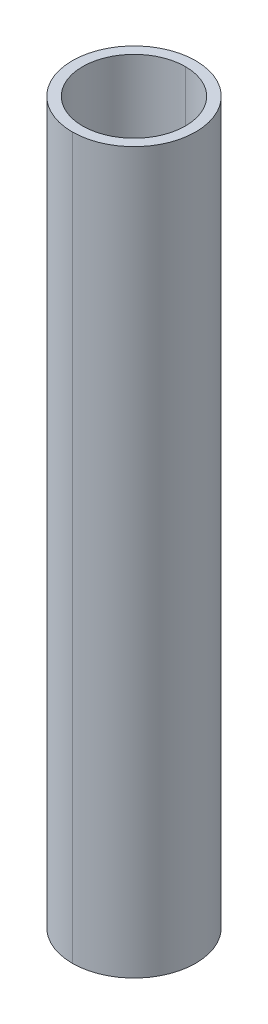
ISO-10303-21;
HEADER;
FILE_DESCRIPTION(('STEP AP214'),'2;1');
FILE_NAME('part.step','',(''),(''),'','','');
FILE_SCHEMA(('AUTOMOTIVE_DESIGN { 1 0 10303 214 1 1 1 1 }'));
ENDSEC;
DATA;
#1=APPLICATION_CONTEXT('core data for automotive mechanical design processes');
#2=APPLICATION_PROTOCOL_DEFINITION('international standard','automotive_design',2000,#1);
#3=PRODUCT_CONTEXT('',#1,'mechanical');
#4=PRODUCT('Part','Part','',(#3));
#5=PRODUCT_RELATED_PRODUCT_CATEGORY('part','',(#4));
#6=PRODUCT_DEFINITION_FORMATION('','',#4);
#7=PRODUCT_DEFINITION_CONTEXT('part definition',#1,'design');
#8=PRODUCT_DEFINITION('design','',#6,#7);
#9=PRODUCT_DEFINITION_SHAPE('','',#8);
#10=(LENGTH_UNIT() NAMED_UNIT(*) SI_UNIT(.MILLI.,.METRE.));
#11=(NAMED_UNIT(*) PLANE_ANGLE_UNIT() SI_UNIT($,.RADIAN.));
#12=(NAMED_UNIT(*) SI_UNIT($,.STERADIAN.) SOLID_ANGLE_UNIT());
#13=UNCERTAINTY_MEASURE_WITH_UNIT(LENGTH_MEASURE(1.E-05),#10,'distance_accuracy_value','');
#14=(GEOMETRIC_REPRESENTATION_CONTEXT(3) GLOBAL_UNCERTAINTY_ASSIGNED_CONTEXT((#13)) GLOBAL_UNIT_ASSIGNED_CONTEXT((#10,
#11,#12)) REPRESENTATION_CONTEXT('',''));
#15=CARTESIAN_POINT('',(0.,0.,0.));
#16=DIRECTION('',(0.,0.,1.));
#17=DIRECTION('',(1.,0.,0.));
#18=AXIS2_PLACEMENT_3D('',#15,#16,#17);
#19=CARTESIAN_POINT('',(0.,150.,0.));
#20=DIRECTION('',(0.,-1.,0.));
#21=DIRECTION('',(0.,0.,-1.));
#22=AXIS2_PLACEMENT_3D('',#19,#20,#21);
#23=CYLINDRICAL_SURFACE('',#22,5.);
#24=CARTESIAN_POINT('',(0.,70.,0.));
#25=DIRECTION('',(0.,1.,0.));
#26=DIRECTION('',(0.,0.,1.));
#27=AXIS2_PLACEMENT_3D('',#24,#25,#26);
#28=CIRCLE('',#27,5.);
#29=CARTESIAN_POINT('',(0.,70.,5.));
#30=VERTEX_POINT('',#29);
#31=CARTESIAN_POINT('',(0.,70.,-5.));
#32=VERTEX_POINT('',#31);
#33=EDGE_CURVE('E56',#30,#32,#28,.F.);
#34=ORIENTED_EDGE('',*,*,#33,.F.);
#35=DIRECTION('',(0.,-1.,0.));
#36=VECTOR('',#35,1.);
#37=CARTESIAN_POINT('',(0.,150.,5.));
#38=LINE('',#37,#36);
#39=CARTESIAN_POINT('',(0.,0.,5.));
#40=VERTEX_POINT('',#39);
#41=EDGE_CURVE('E44',#30,#40,#38,.T.);
#42=ORIENTED_EDGE('',*,*,#41,.T.);
#43=CARTESIAN_POINT('',(0.,0.,0.));
#44=DIRECTION('',(0.,1.,0.));
#45=DIRECTION('',(0.,0.,1.));
#46=AXIS2_PLACEMENT_3D('',#43,#44,#45);
#47=CIRCLE('',#46,5.);
#48=CARTESIAN_POINT('',(0.,0.,-5.));
#49=VERTEX_POINT('',#48);
#50=EDGE_CURVE('E96',#49,#40,#47,.T.);
#51=ORIENTED_EDGE('',*,*,#50,.F.);
#52=DIRECTION('',(0.,-1.,0.));
#53=VECTOR('',#52,1.);
#54=CARTESIAN_POINT('',(0.,150.,-5.));
#55=LINE('',#54,#53);
#56=EDGE_CURVE('E100',#32,#49,#55,.T.);
#57=ORIENTED_EDGE('',*,*,#56,.F.);
#58=EDGE_LOOP('',(#34,#42,#51,#57));
#59=FACE_BOUND('',#58,.T.);
#60=ADVANCED_FACE('F36',(#59),#23,.F.);
#61=CARTESIAN_POINT('',(0.,150.,0.));
#62=DIRECTION('',(0.,-1.,0.));
#63=DIRECTION('',(0.,0.,-1.));
#64=AXIS2_PLACEMENT_3D('',#61,#62,#63);
#65=CYLINDRICAL_SURFACE('',#64,6.);
#66=DIRECTION('',(0.,-1.,0.));
#67=VECTOR('',#66,1.);
#68=CARTESIAN_POINT('',(0.,150.,-6.));
#69=LINE('',#68,#67);
#70=CARTESIAN_POINT('',(0.,70.,-6.));
#71=VERTEX_POINT('',#70);
#72=CARTESIAN_POINT('',(0.,0.,-6.));
#73=VERTEX_POINT('',#72);
#74=EDGE_CURVE('E87',#71,#73,#69,.T.);
#75=ORIENTED_EDGE('',*,*,#74,.F.);
#76=CARTESIAN_POINT('',(0.,70.,0.));
#77=DIRECTION('',(0.,1.,0.));
#78=DIRECTION('',(0.,0.,1.));
#79=AXIS2_PLACEMENT_3D('',#76,#77,#78);
#80=CIRCLE('',#79,6.);
#81=CARTESIAN_POINT('',(0.,70.,6.));
#82=VERTEX_POINT('',#81);
#83=EDGE_CURVE('E50',#82,#71,#80,.T.);
#84=ORIENTED_EDGE('',*,*,#83,.F.);
#85=DIRECTION('',(0.,-1.,0.));
#86=VECTOR('',#85,1.);
#87=CARTESIAN_POINT('',(0.,150.,6.));
#88=LINE('',#87,#86);
#89=CARTESIAN_POINT('',(0.,0.,6.));
#90=VERTEX_POINT('',#89);
#91=EDGE_CURVE('E85',#82,#90,#88,.T.);
#92=ORIENTED_EDGE('',*,*,#91,.T.);
#93=CARTESIAN_POINT('',(0.,0.,0.));
#94=DIRECTION('',(0.,1.,0.));
#95=DIRECTION('',(0.,0.,1.));
#96=AXIS2_PLACEMENT_3D('',#93,#94,#95);
#97=CIRCLE('',#96,6.);
#98=EDGE_CURVE('E92',#90,#73,#97,.T.);
#99=ORIENTED_EDGE('',*,*,#98,.T.);
#100=EDGE_LOOP('',(#75,#84,#92,#99));
#101=FACE_BOUND('',#100,.T.);
#102=ADVANCED_FACE('F38',(#101),#65,.T.);
#103=CARTESIAN_POINT('',(0.,150.,0.));
#104=DIRECTION('',(0.,-1.,0.));
#105=DIRECTION('',(0.,0.,-1.));
#106=AXIS2_PLACEMENT_3D('',#103,#104,#105);
#107=CYLINDRICAL_SURFACE('',#106,6.);
#108=ORIENTED_EDGE('',*,*,#91,.F.);
#109=EDGE_CURVE('E77',#71,#82,#80,.T.);
#110=ORIENTED_EDGE('',*,*,#109,.F.);
#111=ORIENTED_EDGE('',*,*,#74,.T.);
#112=CARTESIAN_POINT('',(0.,0.,0.));
#113=DIRECTION('',(0.,1.,0.));
#114=DIRECTION('',(0.,0.,1.));
#115=AXIS2_PLACEMENT_3D('',#112,#113,#114);
#116=CIRCLE('',#115,6.);
#117=EDGE_CURVE('E91',#73,#90,#116,.T.);
#118=ORIENTED_EDGE('',*,*,#117,.T.);
#119=EDGE_LOOP('',(#108,#110,#111,#118));
#120=FACE_BOUND('',#119,.T.);
#121=ADVANCED_FACE('F89',(#120),#107,.T.);
#122=CARTESIAN_POINT('',(0.,150.,0.));
#123=DIRECTION('',(0.,-1.,0.));
#124=DIRECTION('',(0.,0.,-1.));
#125=AXIS2_PLACEMENT_3D('',#122,#123,#124);
#126=CYLINDRICAL_SURFACE('',#125,5.);
#127=CARTESIAN_POINT('',(0.,70.,0.));
#128=DIRECTION('',(0.,1.,0.));
#129=DIRECTION('',(0.,0.,1.));
#130=AXIS2_PLACEMENT_3D('',#127,#128,#129);
#131=CIRCLE('',#130,5.);
#132=EDGE_CURVE('E11',#32,#30,#131,.F.);
#133=ORIENTED_EDGE('',*,*,#132,.F.);
#134=ORIENTED_EDGE('',*,*,#56,.T.);
#135=CARTESIAN_POINT('',(0.,0.,0.));
#136=DIRECTION('',(0.,1.,0.));
#137=DIRECTION('',(0.,0.,1.));
#138=AXIS2_PLACEMENT_3D('',#135,#136,#137);
#139=CIRCLE('',#138,5.);
#140=EDGE_CURVE('E110',#40,#49,#139,.T.);
#141=ORIENTED_EDGE('',*,*,#140,.F.);
#142=ORIENTED_EDGE('',*,*,#41,.F.);
#143=EDGE_LOOP('',(#133,#134,#141,#142));
#144=FACE_BOUND('',#143,.T.);
#145=ADVANCED_FACE('F118',(#144),#126,.F.);
#146=CARTESIAN_POINT('',(0.,0.,0.));
#147=DIRECTION('',(0.,1.,0.));
#148=DIRECTION('',(1.,0.,0.));
#149=AXIS2_PLACEMENT_3D('',#146,#147,#148);
#150=PLANE('',#149);
#151=ORIENTED_EDGE('',*,*,#117,.F.);
#152=ORIENTED_EDGE('',*,*,#98,.F.);
#153=EDGE_LOOP('',(#151,#152));
#154=FACE_BOUND('',#153,.T.);
#155=ORIENTED_EDGE('',*,*,#50,.T.);
#156=ORIENTED_EDGE('',*,*,#140,.T.);
#157=EDGE_LOOP('',(#155,#156));
#158=FACE_BOUND('',#157,.T.);
#159=ADVANCED_FACE('F116',(#154,#158),#150,.F.);
#160=CARTESIAN_POINT('',(0.,70.,0.));
#161=DIRECTION('',(0.,1.,0.));
#162=DIRECTION('',(0.,0.,1.));
#163=AXIS2_PLACEMENT_3D('',#160,#161,#162);
#164=PLANE('',#163);
#165=ORIENTED_EDGE('',*,*,#83,.T.);
#166=ORIENTED_EDGE('',*,*,#109,.T.);
#167=EDGE_LOOP('',(#165,#166));
#168=FACE_BOUND('',#167,.T.);
#169=ORIENTED_EDGE('',*,*,#33,.T.);
#170=ORIENTED_EDGE('',*,*,#132,.T.);
#171=EDGE_LOOP('',(#169,#170));
#172=FACE_BOUND('',#171,.T.);
#173=ADVANCED_FACE('F78',(#168,#172),#164,.T.);
#174=CLOSED_SHELL('',(#60,#102,#121,#145,#159,#173));
#175=MANIFOLD_SOLID_BREP('B2',#174);
#176=ADVANCED_BREP_SHAPE_REPRESENTATION('',(#18,#175),#14);
#177=SHAPE_DEFINITION_REPRESENTATION(#9,#176);
ENDSEC;
END-ISO-10303-21;
